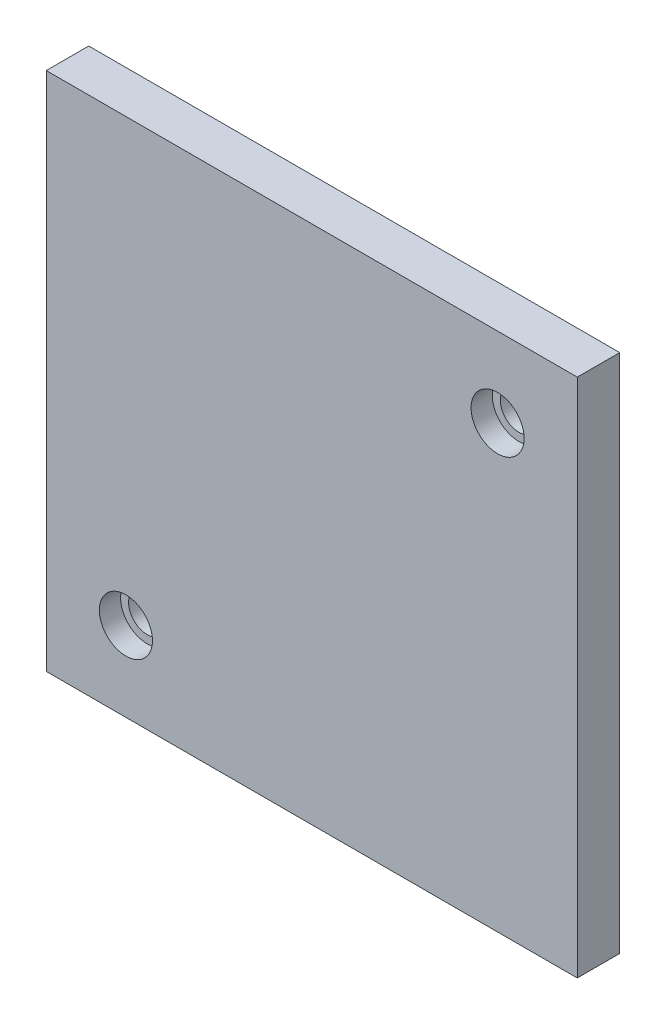
ISO-10303-21;
HEADER;
FILE_DESCRIPTION(('STEP AP214'),'2;1');
FILE_NAME('part.step','',(''),(''),'','','');
FILE_SCHEMA(('AUTOMOTIVE_DESIGN { 1 0 10303 214 1 1 1 1 }'));
ENDSEC;
DATA;
#1=APPLICATION_CONTEXT('core data for automotive mechanical design processes');
#2=APPLICATION_PROTOCOL_DEFINITION('international standard','automotive_design',2000,#1);
#3=PRODUCT_CONTEXT('',#1,'mechanical');
#4=PRODUCT('Part','Part','',(#3));
#5=PRODUCT_RELATED_PRODUCT_CATEGORY('part','',(#4));
#6=PRODUCT_DEFINITION_FORMATION('','',#4);
#7=PRODUCT_DEFINITION_CONTEXT('part definition',#1,'design');
#8=PRODUCT_DEFINITION('design','',#6,#7);
#9=PRODUCT_DEFINITION_SHAPE('','',#8);
#10=(LENGTH_UNIT() NAMED_UNIT(*) SI_UNIT(.MILLI.,.METRE.));
#11=(NAMED_UNIT(*) PLANE_ANGLE_UNIT() SI_UNIT($,.RADIAN.));
#12=(NAMED_UNIT(*) SI_UNIT($,.STERADIAN.) SOLID_ANGLE_UNIT());
#13=UNCERTAINTY_MEASURE_WITH_UNIT(LENGTH_MEASURE(1.E-05),#10,'distance_accuracy_value','');
#14=(GEOMETRIC_REPRESENTATION_CONTEXT(3) GLOBAL_UNCERTAINTY_ASSIGNED_CONTEXT((#13)) GLOBAL_UNIT_ASSIGNED_CONTEXT((#10,
#11,#12)) REPRESENTATION_CONTEXT('',''));
#15=CARTESIAN_POINT('',(0.,0.,0.));
#16=DIRECTION('',(0.,0.,1.));
#17=DIRECTION('',(1.,0.,0.));
#18=AXIS2_PLACEMENT_3D('',#15,#16,#17);
#19=CARTESIAN_POINT('',(-25.,24.5,4.));
#20=DIRECTION('',(1.,0.,0.));
#21=DIRECTION('',(0.,1.,0.));
#22=AXIS2_PLACEMENT_3D('',#19,#20,#21);
#23=PLANE('',#22);
#24=DIRECTION('',(0.,-1.,0.));
#25=VECTOR('',#24,1.);
#26=CARTESIAN_POINT('',(-25.,24.5,0.));
#27=LINE('',#26,#25);
#28=CARTESIAN_POINT('',(-25.,24.5,0.));
#29=VERTEX_POINT('',#28);
#30=CARTESIAN_POINT('',(-25.,-24.5,0.));
#31=VERTEX_POINT('',#30);
#32=EDGE_CURVE('E103',#29,#31,#27,.T.);
#33=ORIENTED_EDGE('',*,*,#32,.T.);
#34=DIRECTION('',(0.,0.,-1.));
#35=VECTOR('',#34,1.);
#36=CARTESIAN_POINT('',(-25.,-24.5,4.));
#37=LINE('',#36,#35);
#38=CARTESIAN_POINT('',(-25.,-24.5,4.));
#39=VERTEX_POINT('',#38);
#40=EDGE_CURVE('E11',#39,#31,#37,.T.);
#41=ORIENTED_EDGE('',*,*,#40,.F.);
#42=DIRECTION('',(0.,-1.,0.));
#43=VECTOR('',#42,1.);
#44=CARTESIAN_POINT('',(-25.,24.5,4.));
#45=LINE('',#44,#43);
#46=CARTESIAN_POINT('',(-25.,24.5,4.));
#47=VERTEX_POINT('',#46);
#48=EDGE_CURVE('E90',#47,#39,#45,.T.);
#49=ORIENTED_EDGE('',*,*,#48,.F.);
#50=DIRECTION('',(0.,0.,-1.));
#51=VECTOR('',#50,1.);
#52=CARTESIAN_POINT('',(-25.,24.5,4.));
#53=LINE('',#52,#51);
#54=EDGE_CURVE('E99',#47,#29,#53,.T.);
#55=ORIENTED_EDGE('',*,*,#54,.T.);
#56=EDGE_LOOP('',(#33,#41,#49,#55));
#57=FACE_BOUND('',#56,.T.);
#58=ADVANCED_FACE('F37',(#57),#23,.F.);
#59=CARTESIAN_POINT('',(25.,-24.5,4.));
#60=DIRECTION('',(0.,1.,0.));
#61=DIRECTION('',(-1.,0.,0.));
#62=AXIS2_PLACEMENT_3D('',#59,#60,#61);
#63=PLANE('',#62);
#64=DIRECTION('',(1.,0.,0.));
#65=VECTOR('',#64,1.);
#66=CARTESIAN_POINT('',(25.,-24.5,0.));
#67=LINE('',#66,#65);
#68=CARTESIAN_POINT('',(25.,-24.5,0.));
#69=VERTEX_POINT('',#68);
#70=EDGE_CURVE('E94',#31,#69,#67,.T.);
#71=ORIENTED_EDGE('',*,*,#70,.T.);
#72=DIRECTION('',(0.,0.,-1.));
#73=VECTOR('',#72,1.);
#74=CARTESIAN_POINT('',(25.,-24.5,4.));
#75=LINE('',#74,#73);
#76=CARTESIAN_POINT('',(25.,-24.5,4.));
#77=VERTEX_POINT('',#76);
#78=EDGE_CURVE('E46',#77,#69,#75,.T.);
#79=ORIENTED_EDGE('',*,*,#78,.F.);
#80=DIRECTION('',(1.,0.,0.));
#81=VECTOR('',#80,1.);
#82=CARTESIAN_POINT('',(25.,-24.5,4.));
#83=LINE('',#82,#81);
#84=EDGE_CURVE('E85',#39,#77,#83,.T.);
#85=ORIENTED_EDGE('',*,*,#84,.F.);
#86=ORIENTED_EDGE('',*,*,#40,.T.);
#87=EDGE_LOOP('',(#71,#79,#85,#86));
#88=FACE_BOUND('',#87,.T.);
#89=ADVANCED_FACE('F93',(#88),#63,.F.);
#90=CARTESIAN_POINT('',(25.,24.5,4.));
#91=DIRECTION('',(-1.,0.,0.));
#92=DIRECTION('',(0.,-1.,0.));
#93=AXIS2_PLACEMENT_3D('',#90,#91,#92);
#94=PLANE('',#93);
#95=DIRECTION('',(0.,1.,0.));
#96=VECTOR('',#95,1.);
#97=CARTESIAN_POINT('',(25.,24.5,0.));
#98=LINE('',#97,#96);
#99=CARTESIAN_POINT('',(25.,24.5,0.));
#100=VERTEX_POINT('',#99);
#101=EDGE_CURVE('E72',#69,#100,#98,.T.);
#102=ORIENTED_EDGE('',*,*,#101,.T.);
#103=DIRECTION('',(0.,0.,-1.));
#104=VECTOR('',#103,1.);
#105=CARTESIAN_POINT('',(25.,24.5,4.));
#106=LINE('',#105,#104);
#107=CARTESIAN_POINT('',(25.,24.5,4.));
#108=VERTEX_POINT('',#107);
#109=EDGE_CURVE('E95',#108,#100,#106,.T.);
#110=ORIENTED_EDGE('',*,*,#109,.F.);
#111=DIRECTION('',(0.,1.,0.));
#112=VECTOR('',#111,1.);
#113=CARTESIAN_POINT('',(25.,24.5,4.));
#114=LINE('',#113,#112);
#115=EDGE_CURVE('E88',#77,#108,#114,.T.);
#116=ORIENTED_EDGE('',*,*,#115,.F.);
#117=ORIENTED_EDGE('',*,*,#78,.T.);
#118=EDGE_LOOP('',(#102,#110,#116,#117));
#119=FACE_BOUND('',#118,.T.);
#120=ADVANCED_FACE('F97',(#119),#94,.F.);
#121=CARTESIAN_POINT('',(25.,24.5,4.));
#122=DIRECTION('',(0.,-1.,0.));
#123=DIRECTION('',(1.,0.,0.));
#124=AXIS2_PLACEMENT_3D('',#121,#122,#123);
#125=PLANE('',#124);
#126=DIRECTION('',(-1.,0.,0.));
#127=VECTOR('',#126,1.);
#128=CARTESIAN_POINT('',(25.,24.5,0.));
#129=LINE('',#128,#127);
#130=EDGE_CURVE('E78',#100,#29,#129,.T.);
#131=ORIENTED_EDGE('',*,*,#130,.T.);
#132=ORIENTED_EDGE('',*,*,#54,.F.);
#133=DIRECTION('',(-1.,0.,0.));
#134=VECTOR('',#133,1.);
#135=CARTESIAN_POINT('',(25.,24.5,4.));
#136=LINE('',#135,#134);
#137=EDGE_CURVE('E55',#108,#47,#136,.T.);
#138=ORIENTED_EDGE('',*,*,#137,.F.);
#139=ORIENTED_EDGE('',*,*,#109,.T.);
#140=EDGE_LOOP('',(#131,#132,#138,#139));
#141=FACE_BOUND('',#140,.T.);
#142=ADVANCED_FACE('F141',(#141),#125,.F.);
#143=CARTESIAN_POINT('',(0.,0.,4.));
#144=DIRECTION('',(0.,0.,-1.));
#145=DIRECTION('',(-1.,0.,0.));
#146=AXIS2_PLACEMENT_3D('',#143,#144,#145);
#147=PLANE('',#146);
#148=CARTESIAN_POINT('',(17.5,17.,4.));
#149=DIRECTION('',(0.,0.,1.));
#150=DIRECTION('',(1.,0.,0.));
#151=AXIS2_PLACEMENT_3D('',#148,#149,#150);
#152=CIRCLE('',#151,2.5);
#153=CARTESIAN_POINT('',(20.,17.,4.));
#154=VERTEX_POINT('',#153);
#155=EDGE_CURVE('E128',#154,#154,#152,.T.);
#156=ORIENTED_EDGE('',*,*,#155,.F.);
#157=EDGE_LOOP('',(#156));
#158=FACE_BOUND('',#157,.T.);
#159=CARTESIAN_POINT('',(-17.5,-17.,4.));
#160=DIRECTION('',(0.,0.,1.));
#161=DIRECTION('',(1.,0.,0.));
#162=AXIS2_PLACEMENT_3D('',#159,#160,#161);
#163=CIRCLE('',#162,2.5);
#164=CARTESIAN_POINT('',(-15.,-17.,4.));
#165=VERTEX_POINT('',#164);
#166=EDGE_CURVE('E117',#165,#165,#163,.T.);
#167=ORIENTED_EDGE('',*,*,#166,.F.);
#168=EDGE_LOOP('',(#167));
#169=FACE_BOUND('',#168,.T.);
#170=ORIENTED_EDGE('',*,*,#48,.T.);
#171=ORIENTED_EDGE('',*,*,#84,.T.);
#172=ORIENTED_EDGE('',*,*,#115,.T.);
#173=ORIENTED_EDGE('',*,*,#137,.T.);
#174=EDGE_LOOP('',(#170,#171,#172,#173));
#175=FACE_BOUND('',#174,.T.);
#176=ADVANCED_FACE('F86',(#158,#169,#175),#147,.F.);
#177=CARTESIAN_POINT('',(0.,0.,0.));
#178=DIRECTION('',(0.,0.,-1.));
#179=DIRECTION('',(-1.,0.,0.));
#180=AXIS2_PLACEMENT_3D('',#177,#178,#179);
#181=PLANE('',#180);
#182=CARTESIAN_POINT('',(-17.5,-17.,0.));
#183=DIRECTION('',(0.,0.,-1.));
#184=DIRECTION('',(-1.,0.,0.));
#185=AXIS2_PLACEMENT_3D('',#182,#183,#184);
#186=CIRCLE('',#185,1.75);
#187=CARTESIAN_POINT('',(-19.25,-17.,0.));
#188=VERTEX_POINT('',#187);
#189=EDGE_CURVE('E40',#188,#188,#186,.T.);
#190=ORIENTED_EDGE('',*,*,#189,.F.);
#191=EDGE_LOOP('',(#190));
#192=FACE_BOUND('',#191,.T.);
#193=CARTESIAN_POINT('',(17.5,17.,0.));
#194=DIRECTION('',(0.,0.,-1.));
#195=DIRECTION('',(-1.,0.,0.));
#196=AXIS2_PLACEMENT_3D('',#193,#194,#195);
#197=CIRCLE('',#196,1.75);
#198=CARTESIAN_POINT('',(15.75,17.,0.));
#199=VERTEX_POINT('',#198);
#200=EDGE_CURVE('E111',#199,#199,#197,.T.);
#201=ORIENTED_EDGE('',*,*,#200,.F.);
#202=EDGE_LOOP('',(#201));
#203=FACE_BOUND('',#202,.T.);
#204=ORIENTED_EDGE('',*,*,#32,.F.);
#205=ORIENTED_EDGE('',*,*,#130,.F.);
#206=ORIENTED_EDGE('',*,*,#101,.F.);
#207=ORIENTED_EDGE('',*,*,#70,.F.);
#208=EDGE_LOOP('',(#204,#205,#206,#207));
#209=FACE_BOUND('',#208,.T.);
#210=ADVANCED_FACE('F140',(#192,#203,#209),#181,.T.);
#211=CARTESIAN_POINT('',(-17.5,-17.,2.));
#212=DIRECTION('',(0.,0.,1.));
#213=DIRECTION('',(1.,0.,0.));
#214=AXIS2_PLACEMENT_3D('',#211,#212,#213);
#215=CYLINDRICAL_SURFACE('',#214,2.5);
#216=CARTESIAN_POINT('',(-17.5,-17.,2.));
#217=DIRECTION('',(0.,0.,1.));
#218=DIRECTION('',(1.,0.,0.));
#219=AXIS2_PLACEMENT_3D('',#216,#217,#218);
#220=CIRCLE('',#219,2.5);
#221=CARTESIAN_POINT('',(-15.,-17.,2.));
#222=VERTEX_POINT('',#221);
#223=EDGE_CURVE('E131',#222,#222,#220,.T.);
#224=ORIENTED_EDGE('',*,*,#223,.F.);
#225=EDGE_LOOP('',(#224));
#226=FACE_BOUND('',#225,.T.);
#227=ORIENTED_EDGE('',*,*,#166,.T.);
#228=EDGE_LOOP('',(#227));
#229=FACE_BOUND('',#228,.T.);
#230=ADVANCED_FACE('F137',(#226,#229),#215,.F.);
#231=CARTESIAN_POINT('',(-17.5,-17.,2.));
#232=DIRECTION('',(0.,0.,1.));
#233=DIRECTION('',(1.,0.,0.));
#234=AXIS2_PLACEMENT_3D('',#231,#232,#233);
#235=PLANE('',#234);
#236=CARTESIAN_POINT('',(-17.5,-17.,2.));
#237=DIRECTION('',(0.,0.,1.));
#238=DIRECTION('',(1.,0.,0.));
#239=AXIS2_PLACEMENT_3D('',#236,#237,#238);
#240=CIRCLE('',#239,1.75);
#241=CARTESIAN_POINT('',(-15.75,-17.,2.));
#242=VERTEX_POINT('',#241);
#243=EDGE_CURVE('E113',#242,#242,#240,.T.);
#244=ORIENTED_EDGE('',*,*,#243,.F.);
#245=EDGE_LOOP('',(#244));
#246=FACE_BOUND('',#245,.T.);
#247=ORIENTED_EDGE('',*,*,#223,.T.);
#248=EDGE_LOOP('',(#247));
#249=FACE_BOUND('',#248,.T.);
#250=ADVANCED_FACE('F184',(#246,#249),#235,.T.);
#251=CARTESIAN_POINT('',(17.5,17.,2.));
#252=DIRECTION('',(0.,0.,1.));
#253=DIRECTION('',(1.,0.,0.));
#254=AXIS2_PLACEMENT_3D('',#251,#252,#253);
#255=CYLINDRICAL_SURFACE('',#254,2.5);
#256=CARTESIAN_POINT('',(17.5,17.,2.));
#257=DIRECTION('',(0.,0.,1.));
#258=DIRECTION('',(1.,0.,0.));
#259=AXIS2_PLACEMENT_3D('',#256,#257,#258);
#260=CIRCLE('',#259,2.5);
#261=CARTESIAN_POINT('',(20.,17.,2.));
#262=VERTEX_POINT('',#261);
#263=EDGE_CURVE('E106',#262,#262,#260,.T.);
#264=ORIENTED_EDGE('',*,*,#263,.F.);
#265=EDGE_LOOP('',(#264));
#266=FACE_BOUND('',#265,.T.);
#267=ORIENTED_EDGE('',*,*,#155,.T.);
#268=EDGE_LOOP('',(#267));
#269=FACE_BOUND('',#268,.T.);
#270=ADVANCED_FACE('F191',(#266,#269),#255,.F.);
#271=CARTESIAN_POINT('',(17.5,17.,2.));
#272=DIRECTION('',(0.,0.,1.));
#273=DIRECTION('',(1.,0.,0.));
#274=AXIS2_PLACEMENT_3D('',#271,#272,#273);
#275=PLANE('',#274);
#276=CARTESIAN_POINT('',(17.5,17.,2.));
#277=DIRECTION('',(0.,0.,1.));
#278=DIRECTION('',(1.,0.,0.));
#279=AXIS2_PLACEMENT_3D('',#276,#277,#278);
#280=CIRCLE('',#279,1.75);
#281=CARTESIAN_POINT('',(19.25,17.,2.));
#282=VERTEX_POINT('',#281);
#283=EDGE_CURVE('E119',#282,#282,#280,.T.);
#284=ORIENTED_EDGE('',*,*,#283,.F.);
#285=EDGE_LOOP('',(#284));
#286=FACE_BOUND('',#285,.T.);
#287=ORIENTED_EDGE('',*,*,#263,.T.);
#288=EDGE_LOOP('',(#287));
#289=FACE_BOUND('',#288,.T.);
#290=ADVANCED_FACE('F196',(#286,#289),#275,.T.);
#291=CARTESIAN_POINT('',(17.5,17.,-2.));
#292=DIRECTION('',(0.,0.,1.));
#293=DIRECTION('',(1.,0.,0.));
#294=AXIS2_PLACEMENT_3D('',#291,#292,#293);
#295=CYLINDRICAL_SURFACE('',#294,1.75);
#296=ORIENTED_EDGE('',*,*,#200,.T.);
#297=EDGE_LOOP('',(#296));
#298=FACE_BOUND('',#297,.T.);
#299=ORIENTED_EDGE('',*,*,#283,.T.);
#300=EDGE_LOOP('',(#299));
#301=FACE_BOUND('',#300,.T.);
#302=ADVANCED_FACE('F218',(#298,#301),#295,.F.);
#303=CARTESIAN_POINT('',(-17.5,-17.,-2.));
#304=DIRECTION('',(0.,0.,1.));
#305=DIRECTION('',(1.,0.,0.));
#306=AXIS2_PLACEMENT_3D('',#303,#304,#305);
#307=CYLINDRICAL_SURFACE('',#306,1.75);
#308=ORIENTED_EDGE('',*,*,#189,.T.);
#309=EDGE_LOOP('',(#308));
#310=FACE_BOUND('',#309,.T.);
#311=ORIENTED_EDGE('',*,*,#243,.T.);
#312=EDGE_LOOP('',(#311));
#313=FACE_BOUND('',#312,.T.);
#314=ADVANCED_FACE('F228',(#310,#313),#307,.F.);
#315=CLOSED_SHELL('',(#58,#89,#120,#142,#176,#210,#230,#250,#270,#290,#302,#314));
#316=MANIFOLD_SOLID_BREP('B2',#315);
#317=ADVANCED_BREP_SHAPE_REPRESENTATION('',(#18,#316),#14);
#318=SHAPE_DEFINITION_REPRESENTATION(#9,#317);
ENDSEC;
END-ISO-10303-21;
